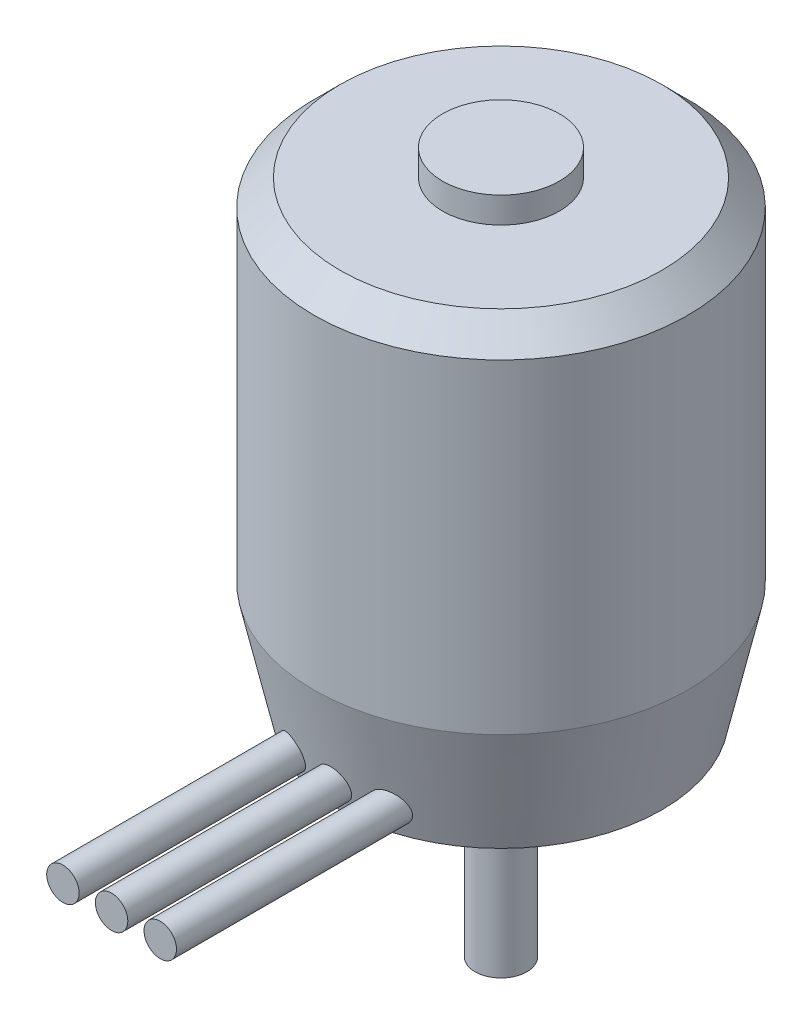
ISO-10303-21;
HEADER;
FILE_DESCRIPTION(('STEP AP214'),'2;1');
FILE_NAME('part.step','',(''),(''),'','','');
FILE_SCHEMA(('AUTOMOTIVE_DESIGN { 1 0 10303 214 1 1 1 1 }'));
ENDSEC;
DATA;
#1=APPLICATION_CONTEXT('core data for automotive mechanical design processes');
#2=APPLICATION_PROTOCOL_DEFINITION('international standard','automotive_design',2000,#1);
#3=PRODUCT_CONTEXT('',#1,'mechanical');
#4=PRODUCT('Part','Part','',(#3));
#5=PRODUCT_RELATED_PRODUCT_CATEGORY('part','',(#4));
#6=PRODUCT_DEFINITION_FORMATION('','',#4);
#7=PRODUCT_DEFINITION_CONTEXT('part definition',#1,'design');
#8=PRODUCT_DEFINITION('design','',#6,#7);
#9=PRODUCT_DEFINITION_SHAPE('','',#8);
#10=(LENGTH_UNIT() NAMED_UNIT(*) SI_UNIT(.MILLI.,.METRE.));
#11=(NAMED_UNIT(*) PLANE_ANGLE_UNIT() SI_UNIT($,.RADIAN.));
#12=(NAMED_UNIT(*) SI_UNIT($,.STERADIAN.) SOLID_ANGLE_UNIT());
#13=UNCERTAINTY_MEASURE_WITH_UNIT(LENGTH_MEASURE(1.E-05),#10,'distance_accuracy_value','');
#14=(GEOMETRIC_REPRESENTATION_CONTEXT(3) GLOBAL_UNCERTAINTY_ASSIGNED_CONTEXT((#13)) GLOBAL_UNIT_ASSIGNED_CONTEXT((#10,
#11,#12)) REPRESENTATION_CONTEXT('',''));
#15=CARTESIAN_POINT('',(0.,0.,0.));
#16=DIRECTION('',(0.,0.,1.));
#17=DIRECTION('',(1.,0.,0.));
#18=AXIS2_PLACEMENT_3D('',#15,#16,#17);
#19=CARTESIAN_POINT('',(0.,-54.0247048165027,0.));
#20=DIRECTION('',(0.,1.,0.));
#21=DIRECTION('',(0.,0.,1.));
#22=AXIS2_PLACEMENT_3D('',#19,#20,#21);
#23=CONICAL_SURFACE('',#22,12.4,0.218668945873942);
#24=CARTESIAN_POINT('',(0.,-45.0247048165027,0.));
#25=DIRECTION('',(0.,1.,0.));
#26=DIRECTION('',(0.,0.,1.));
#27=AXIS2_PLACEMENT_3D('',#24,#25,#26);
#28=CIRCLE('',#27,14.4);
#29=CARTESIAN_POINT('',(0.,-45.0247048165027,14.4));
#30=VERTEX_POINT('',#29);
#31=EDGE_CURVE('E152',#30,#30,#28,.T.);
#32=ORIENTED_EDGE('',*,*,#31,.F.);
#33=EDGE_LOOP('',(#32));
#34=FACE_BOUND('',#33,.T.);
#35=CARTESIAN_POINT('',(0.,-54.0247048165027,0.));
#36=DIRECTION('',(0.,1.,0.));
#37=DIRECTION('',(0.,0.,1.));
#38=AXIS2_PLACEMENT_3D('',#35,#36,#37);
#39=CIRCLE('',#38,12.4);
#40=CARTESIAN_POINT('',(0.,-54.0247048165027,12.4));
#41=VERTEX_POINT('',#40);
#42=EDGE_CURVE('E156',#41,#41,#39,.T.);
#43=ORIENTED_EDGE('',*,*,#42,.T.);
#44=EDGE_LOOP('',(#43));
#45=FACE_BOUND('',#44,.T.);
#46=CARTESIAN_POINT('',(-0.894856304961052,-52.8974775208602,12.6188056007496));
#47=CARTESIAN_POINT('',(-0.846345103135006,-52.9472120296067,12.6111656166559));
#48=CARTESIAN_POINT('',(-0.793576864978535,-52.9929953524686,12.604435219772));
#49=CARTESIAN_POINT('',(-0.680987356765525,-53.0752407638937,12.5927159025926));
#50=CARTESIAN_POINT('',(-0.621159046153157,-53.1116934308457,12.5877287406824));
#51=CARTESIAN_POINT('',(-0.496178174970965,-53.1741324280857,12.5793879256304));
#52=CARTESIAN_POINT('',(-0.431027022786042,-53.2001215162407,12.5760338420121));
#53=CARTESIAN_POINT('',(-0.297257367755014,-53.2408570257483,12.5708514988487));
#54=CARTESIAN_POINT('',(-0.228639553895667,-53.2556056717991,12.5690229373667));
#55=CARTESIAN_POINT('',(-0.0900373401314496,-53.2734097892141,12.5668223936875));
#56=CARTESIAN_POINT('',(-0.0200563538741467,-53.2764914362166,12.566447150836));
#57=CARTESIAN_POINT('',(0.119434212905394,-53.2709422241226,12.5671288188694));
#58=CARTESIAN_POINT('',(0.188943783717849,-53.2623111245096,12.5681857591636));
#59=CARTESIAN_POINT('',(0.325476765356979,-53.2336003989975,12.5717734885063));
#60=CARTESIAN_POINT('',(0.392501534641407,-53.2135271299252,12.5743034592128));
#61=CARTESIAN_POINT('',(0.522205964891759,-53.1625346451718,12.5809265802104));
#62=CARTESIAN_POINT('',(0.584885662437372,-53.1316155208115,12.5850197173399));
#63=CARTESIAN_POINT('',(0.704181421930687,-53.0598272713308,12.5948869666487));
#64=CARTESIAN_POINT('',(0.760792683603932,-53.0189503517881,12.600662396332));
#65=CARTESIAN_POINT('',(0.866319070582212,-52.9284865042545,12.6139981315195));
#66=CARTESIAN_POINT('',(0.915234207977994,-52.8788995899474,12.6215584342196));
#67=CARTESIAN_POINT('',(1.00422666868814,-52.7722809447219,12.6385585274154));
#68=CARTESIAN_POINT('',(1.04426739599402,-52.7152198752405,12.6480058059333));
#69=CARTESIAN_POINT('',(1.11422402824881,-52.5955044574222,12.6687416696049));
#70=CARTESIAN_POINT('',(1.14413947828119,-52.5328498579343,12.6800303374562));
#71=CARTESIAN_POINT('',(1.1934277481378,-52.4030021668634,12.704469488889));
#72=CARTESIAN_POINT('',(1.21267311957141,-52.3357645504836,12.717640211047));
#73=CARTESIAN_POINT('',(1.2396951862456,-52.199329849664,12.7454968702711));
#74=CARTESIAN_POINT('',(1.24747063220397,-52.1301325526161,12.760182972203));
#75=CARTESIAN_POINT('',(1.25152315878021,-51.9902144566371,12.7910279332391));
#76=CARTESIAN_POINT('',(1.24755694001466,-51.919491994871,12.8072111279232));
#77=CARTESIAN_POINT('',(1.22781677737388,-51.7798819830909,12.8402847418432));
#78=CARTESIAN_POINT('',(1.21204115361697,-51.7109946955732,12.857175261373));
#79=CARTESIAN_POINT('',(1.16869620098501,-51.5754655257624,12.8914297002414));
#80=CARTESIAN_POINT('',(1.14088645624252,-51.5089010401906,12.9087961184972));
#81=CARTESIAN_POINT('',(1.07417398394799,-51.3814109927928,12.9429468025529));
#82=CARTESIAN_POINT('',(1.03527043909739,-51.3204858468646,12.9597310253593));
#83=CARTESIAN_POINT('',(0.947232187158211,-51.2058731085233,12.9920001306052));
#84=CARTESIAN_POINT('',(0.898071947626384,-51.1522041393643,13.0074816325387));
#85=CARTESIAN_POINT('',(0.790840453608683,-51.0539543166066,13.0363139972973));
#86=CARTESIAN_POINT('',(0.732770476036033,-51.0093721628451,13.0496651648762));
#87=CARTESIAN_POINT('',(0.611011643812474,-50.9318976131694,13.0731594496612));
#88=CARTESIAN_POINT('',(0.547521255406644,-50.8987174309356,13.0833807003312));
#89=CARTESIAN_POINT('',(0.415422825698364,-50.8435860711981,13.1004977011744));
#90=CARTESIAN_POINT('',(0.346816335143889,-50.8216315068084,13.1073944543471));
#91=CARTESIAN_POINT('',(0.209629322345072,-50.7904891093717,13.1172115958835));
#92=CARTESIAN_POINT('',(0.14117597162765,-50.7807902526124,13.1202910394374));
#93=CARTESIAN_POINT('',(0.00354539297814122,-50.7728117500985,13.122822727134));
#94=CARTESIAN_POINT('',(-0.0656316998802527,-50.7745300102017,13.1222756364603));
#95=CARTESIAN_POINT('',(-0.200831992790418,-50.7891201301702,13.1176513868978));
#96=CARTESIAN_POINT('',(-0.266890347030389,-50.8016987805839,13.1136670298289));
#97=CARTESIAN_POINT('',(-0.395890910053305,-50.8371671367217,13.1025215683412));
#98=CARTESIAN_POINT('',(-0.458833034160296,-50.8600571224609,13.0953603776522));
#99=CARTESIAN_POINT('',(-0.580603039479891,-50.9156829704859,13.0781568454965));
#100=CARTESIAN_POINT('',(-0.639379318179099,-50.9485222028727,13.0680843090315));
#101=CARTESIAN_POINT('',(-0.750616586187429,-51.0229289640814,13.045605506301));
#102=CARTESIAN_POINT('',(-0.803076455039936,-51.0644980378959,13.0331988269834));
#103=CARTESIAN_POINT('',(-0.902352674133521,-51.1569296579293,13.0061200928984));
#104=CARTESIAN_POINT('',(-0.948875112599773,-51.2080876798836,12.9913793630858));
#105=CARTESIAN_POINT('',(-1.03274234306664,-51.3171197813552,12.9606760303748));
#106=CARTESIAN_POINT('',(-1.07008518099734,-51.3749952869762,12.9447131682667));
#107=CARTESIAN_POINT('',(-1.13599044366148,-51.4983032672073,12.9115925790502));
#108=CARTESIAN_POINT('',(-1.16415731130671,-51.5639414713459,12.8944125174864));
#109=CARTESIAN_POINT('',(-1.20893696353795,-51.6990690499777,12.8601311069967));
#110=CARTESIAN_POINT('',(-1.22554887153459,-51.7685587162211,12.8430297641404));
#111=CARTESIAN_POINT('',(-1.24687606903758,-51.9105591674436,12.8092727562553));
#112=CARTESIAN_POINT('',(-1.25141282796949,-51.9830993516317,12.7926273427621));
#113=CARTESIAN_POINT('',(-1.24782183579188,-52.1281657184148,12.7605878423484));
#114=CARTESIAN_POINT('',(-1.23969193128432,-52.2006918965322,12.7451939686643));
#115=CARTESIAN_POINT('',(-1.21102066034535,-52.3426899031741,12.7162523674029));
#116=CARTESIAN_POINT('',(-1.19062867365398,-52.4121878639616,12.7026847881798));
#117=CARTESIAN_POINT('',(-1.13801099664842,-52.5468575819025,12.6774598220234));
#118=CARTESIAN_POINT('',(-1.10580026727052,-52.6120346860574,12.6658000469314));
#119=CARTESIAN_POINT('',(-1.04365208767075,-52.7142825597604,12.6482423061933));
#120=CARTESIAN_POINT('',(-1.01686768601092,-52.7532038603307,12.6417563710055));
#121=CARTESIAN_POINT('',(-0.958999943909115,-52.8278542666365,12.6296413531301));
#122=CARTESIAN_POINT('',(-0.927916698785803,-52.8635834431225,12.6240122514497));
#123=CARTESIAN_POINT('',(-0.894856304961052,-52.8974775208602,12.6188056007496));
#124=B_SPLINE_CURVE_WITH_KNOTS('',3,(#46,#47,#48,#49,#50,#51,#52,#53,#54,#55,#56,#57,#58,#59,
#60,#61,#62,#63,#64,#65,#66,#67,#68,#69,#70,#71,#72,#73,#74,#75,#76,#77,#78,#79,#80,#81,#82,#83,
#84,#85,#86,#87,#88,#89,#90,#91,#92,#93,#94,#95,#96,#97,#98,#99,#100,#101,#102,#103,#104,#105,
#106,#107,#108,#109,#110,#111,#112,#113,#114,#115,#116,#117,#118,#119,#120,#121,#122,#123),
.UNSPECIFIED.,.T.,.F.,(4,2,2,2,2,2,2,2,2,2,2,2,2,2,2,2,2,2,2,2,2,2,2,2,2,2,2,2,2,2,2,2,2,2,2,2,
2,2,4),(0.,0.209510938403255,0.419232602862131,0.628898955108635,0.838523799591173,
1.04767805802813,1.25683661142807,1.46587907752036,1.67491978354113,1.88412464404137,
2.09332917587384,2.3033809980887,2.51344225642713,2.72596131540384,2.93850351983898,
3.15548043469969,3.37248822027949,3.59404742052202,3.81562294761553,4.03775677807918,
4.2598588027666,4.47585222275413,4.6917804367653,4.89837114698654,5.10492396512177,
5.30606866966477,5.50721883682814,5.71053507054672,5.91388731719801,6.12504504030101,
6.33624767389165,6.55562072037157,6.77501040724854,6.99762619626549,7.22027983524312,
7.44027449774615,7.65999163202693,7.80277654426407,7.94555829102521),.UNSPECIFIED.);
#125=CARTESIAN_POINT('',(-0.894856304961052,-52.8974775208602,12.6188056007496));
#126=VERTEX_POINT('',#125);
#127=EDGE_CURVE('E57',#126,#126,#124,.T.);
#128=ORIENTED_EDGE('',*,*,#127,.F.);
#129=EDGE_LOOP('',(#128));
#130=FACE_BOUND('',#129,.T.);
#131=CARTESIAN_POINT('',(3.03347186471275,-53.0489545083952,12.2467356277016));
#132=CARTESIAN_POINT('',(3.09408833278642,-53.0913556184177,12.2220132051164));
#133=CARTESIAN_POINT('',(3.15846846131152,-53.1283592412067,12.1970772116894));
#134=CARTESIAN_POINT('',(3.29281547516374,-53.1904544202445,12.1472003159454));
#135=CARTESIAN_POINT('',(3.36278956201558,-53.2155303229101,12.1222594499164));
#136=CARTESIAN_POINT('',(3.50623829721733,-53.2529440381038,12.0728909146064));
#137=CARTESIAN_POINT('',(3.57971245981064,-53.2652836128809,12.0484631747857));
#138=CARTESIAN_POINT('',(3.72803513255933,-53.2767228611844,12.0007357371516));
#139=CARTESIAN_POINT('',(3.80288329467328,-53.2758258426243,11.9774357589633));
#140=CARTESIAN_POINT('',(3.95094492444576,-53.2606647973468,11.93295761516));
#141=CARTESIAN_POINT('',(4.02416731165254,-53.2465506179046,11.911758605094));
#142=CARTESIAN_POINT('',(4.16761488465627,-53.2052406238288,11.8720605386878));
#143=CARTESIAN_POINT('',(4.23784051133009,-53.1780467407266,11.8535610842192));
#144=CARTESIAN_POINT('',(4.36994547134785,-53.1125280900612,11.8210046488198));
#145=CARTESIAN_POINT('',(4.43205735402293,-53.0747538181402,11.8067863391101));
#146=CARTESIAN_POINT('',(4.54929936775414,-52.988503443404,11.7826572584409));
#147=CARTESIAN_POINT('',(4.60443325469385,-52.9400331365732,11.7727441631669));
#148=CARTESIAN_POINT('',(4.70209126106863,-52.8375245356106,11.7586040548198));
#149=CARTESIAN_POINT('',(4.74523083736378,-52.7841209719252,11.7540250019725));
#150=CARTESIAN_POINT('',(4.82223907579733,-52.6708377221359,11.7498584646615));
#151=CARTESIAN_POINT('',(4.85611187398373,-52.6109609419315,11.7502687495743));
#152=CARTESIAN_POINT('',(4.911854293247,-52.4902778281962,11.7561442780891));
#153=CARTESIAN_POINT('',(4.93430231548076,-52.4297231144716,11.7613173726377));
#154=CARTESIAN_POINT('',(4.96952899464601,-52.3064142903337,11.7762241392066));
#155=CARTESIAN_POINT('',(4.98230799677703,-52.2436602585233,11.7859576483928));
#156=CARTESIAN_POINT('',(4.99816210654692,-52.1176276961352,11.8096612005408));
#157=CARTESIAN_POINT('',(5.0012192323348,-52.054348410433,11.8236390417076));
#158=CARTESIAN_POINT('',(4.99790730788882,-51.9289814400443,11.8552787556471));
#159=CARTESIAN_POINT('',(4.99153586957039,-51.8668940612813,11.872941560781));
#160=CARTESIAN_POINT('',(4.9691778914411,-51.7410337551354,11.9126285013856));
#161=CARTESIAN_POINT('',(4.95255394932831,-51.6774435227195,11.9348704179116));
#162=CARTESIAN_POINT('',(4.91001429609427,-51.5544874930418,11.981967719589));
#163=CARTESIAN_POINT('',(4.88409469197089,-51.4951234782131,12.0068241966255));
#164=CARTESIAN_POINT('',(4.82074402350351,-51.375842495485,12.0609620981626));
#165=CARTESIAN_POINT('',(4.78240403248701,-51.3164950217296,12.0904357873502));
#166=CARTESIAN_POINT('',(4.69665051196157,-51.2053861781305,12.1504798300949));
#167=CARTESIAN_POINT('',(4.64923290052398,-51.1536282396297,12.1810506719639));
#168=CARTESIAN_POINT('',(4.54237481633082,-51.0549952525763,12.2447040076466));
#169=CARTESIAN_POINT('',(4.48227970440111,-51.0088311883726,12.2777937355609));
#170=CARTESIAN_POINT('',(4.35429562636025,-50.9278630389365,12.3428448323757));
#171=CARTESIAN_POINT('',(4.28640511751009,-50.8930612075893,12.374805976283));
#172=CARTESIAN_POINT('',(4.14410213574959,-50.8359699215707,12.4365596535657));
#173=CARTESIAN_POINT('',(4.06965620841018,-50.8137495286314,12.4663394507856));
#174=CARTESIAN_POINT('',(3.91663891712942,-50.7834127558529,12.5223193893351));
#175=CARTESIAN_POINT('',(3.83806944132278,-50.7752899779025,12.5485211495564));
#176=CARTESIAN_POINT('',(3.68495825325505,-50.7742195508789,12.5945452137768));
#177=CARTESIAN_POINT('',(3.61052066750269,-50.780247274762,12.6146861095288));
#178=CARTESIAN_POINT('',(3.46282789167272,-50.8058376613339,12.6501290059092));
#179=CARTESIAN_POINT('',(3.38957193408575,-50.825391143776,12.6654342783298));
#180=CARTESIAN_POINT('',(3.25351644640917,-50.8754552646343,12.6895460021465));
#181=CARTESIAN_POINT('',(3.19037176509052,-50.9048081383533,12.698816781111));
#182=CARTESIAN_POINT('',(3.06948093694394,-50.9738793376385,12.7127888512832));
#183=CARTESIAN_POINT('',(3.01173293191315,-51.0135940773768,12.7174917206082));
#184=CARTESIAN_POINT('',(2.90645424623577,-51.0998709600958,12.7222879452568));
#185=CARTESIAN_POINT('',(2.85854457506863,-51.1459594772136,12.722612080102));
#186=CARTESIAN_POINT('',(2.77068817870192,-51.2450684414393,12.7194943521472));
#187=CARTESIAN_POINT('',(2.73074110103448,-51.2980885815436,12.7160526560872));
#188=CARTESIAN_POINT('',(2.65985166760603,-51.4095307800909,12.7057692923275));
#189=CARTESIAN_POINT('',(2.62890951649515,-51.4679529612635,12.6989275473662));
#190=CARTESIAN_POINT('',(2.5767104128243,-51.5885719394052,12.6822714569141));
#191=CARTESIAN_POINT('',(2.55545478123613,-51.650769249887,12.6724567062917));
#192=CARTESIAN_POINT('',(2.52243654647236,-51.779451793121,12.6499131955799));
#193=CARTESIAN_POINT('',(2.51102259749864,-51.8460109212916,12.6370964341724));
#194=CARTESIAN_POINT('',(2.49901260352434,-51.979623600118,12.6092089684079));
#195=CARTESIAN_POINT('',(2.49841824827072,-52.046677226366,12.5941379123577));
#196=CARTESIAN_POINT('',(2.50805404047622,-52.1825327626742,12.5614382585202));
#197=CARTESIAN_POINT('',(2.51876516988406,-52.2512804177826,12.5437259058477));
#198=CARTESIAN_POINT('',(2.55125599720707,-52.3856688935102,12.5066800274635));
#199=CARTESIAN_POINT('',(2.57304037051849,-52.4513083889801,12.4873458198463));
#200=CARTESIAN_POINT('',(2.62799222405695,-52.5803214192317,12.4465995010083));
#201=CARTESIAN_POINT('',(2.6615803795838,-52.6434991317099,12.4251351970323));
#202=CARTESIAN_POINT('',(2.73877294958224,-52.7629233492432,12.3811690980256));
#203=CARTESIAN_POINT('',(2.78236740528126,-52.8191766608589,12.3586683521933));
#204=CARTESIAN_POINT('',(2.86086767007223,-52.9044710501536,12.3212107602295));
#205=CARTESIAN_POINT('',(2.89321871679685,-52.9359988152731,12.3064667405586));
#206=CARTESIAN_POINT('',(2.96107227933267,-52.9953358626241,12.2767534017467));
#207=CARTESIAN_POINT('',(2.99657483240318,-53.0231451008829,12.2617840799438));
#208=CARTESIAN_POINT('',(3.03347186471275,-53.0489545083952,12.2467356277016));
#209=B_SPLINE_CURVE_WITH_KNOTS('',3,(#131,#132,#133,#134,#135,#136,#137,#138,#139,#140,#141,
#142,#143,#144,#145,#146,#147,#148,#149,#150,#151,#152,#153,#154,#155,#156,#157,#158,#159,#160,
#161,#162,#163,#164,#165,#166,#167,#168,#169,#170,#171,#172,#173,#174,#175,#176,#177,#178,#179,
#180,#181,#182,#183,#184,#185,#186,#187,#188,#189,#190,#191,#192,#193,#194,#195,#196,#197,#198,
#199,#200,#201,#202,#203,#204,#205,#206,#207,#208),.UNSPECIFIED.,.T.,.F.,(4,2,2,2,2,2,2,2,2,2,2,
2,2,2,2,2,2,2,2,2,2,2,2,2,2,2,2,2,2,2,2,2,2,2,2,2,2,2,4),(0.,0.233816075070429,
0.467938162485218,0.702027851489738,0.936059040900011,1.16746865685007,1.39884411011844,
1.61990081193642,1.84083802006823,2.0461764012024,2.25142298342372,2.44486256007249,
2.63829523029222,2.83208547145101,3.02592480457057,3.23323438119832,3.4406308801859,
3.66932972444023,3.8981316501675,4.1450477009016,4.39201270176864,4.64032051196674,
4.88851559977578,5.1192986682092,5.3499252523064,5.55958482058391,5.76917193007233,
5.96766694805335,6.16615317760881,6.36464391770217,6.56316171831639,6.76845306982744,
6.97377648238151,7.18820119748213,7.40271652327343,7.62581704664505,7.8486964846185,
7.99101782966433,8.13334085755648),.UNSPECIFIED.);
#210=CARTESIAN_POINT('',(3.03347186471275,-53.0489545083952,12.2467356277016));
#211=VERTEX_POINT('',#210);
#212=EDGE_CURVE('E53',#211,#211,#209,.T.);
#213=ORIENTED_EDGE('',*,*,#212,.F.);
#214=EDGE_LOOP('',(#213));
#215=FACE_BOUND('',#214,.T.);
#216=CARTESIAN_POINT('',(-4.46564195929878,-53.0495738745248,11.7999599115841));
#217=CARTESIAN_POINT('',(-4.40723744864073,-53.0903519225299,11.8123730823187));
#218=CARTESIAN_POINT('',(-4.34556496839138,-53.1259642588694,11.8268042457465));
#219=CARTESIAN_POINT('',(-4.21769759178863,-53.1860705734683,11.8588311862295));
#220=CARTESIAN_POINT('',(-4.15149359706919,-53.2105413808967,11.8764334530903));
#221=CARTESIAN_POINT('',(-4.01676267998631,-53.2478999280954,11.9139131697781));
#222=CARTESIAN_POINT('',(-3.94824377382249,-53.2608240871186,11.9337832414955));
#223=CARTESIAN_POINT('',(-3.81053499333861,-53.2751561860704,11.975123390013));
#224=CARTESIAN_POINT('',(-3.74134536361318,-53.2765681768918,11.9965929013198));
#225=CARTESIAN_POINT('',(-3.60086160097132,-53.2678586901656,12.0415458027765));
#226=CARTESIAN_POINT('',(-3.52961509601429,-53.2572091189464,12.0650763791845));
#227=CARTESIAN_POINT('',(-3.39015557296129,-53.2239352702586,12.1126819231121));
#228=CARTESIAN_POINT('',(-3.32194333437576,-53.2013079347137,12.1367570281536));
#229=CARTESIAN_POINT('',(-3.18840986198111,-53.1438812631411,12.1857228560472));
#230=CARTESIAN_POINT('',(-3.12323908441483,-53.1087335300541,12.2106161675719));
#231=CARTESIAN_POINT('',(-3.0000174271302,-53.0274385156567,12.2600729092805));
#232=CARTESIAN_POINT('',(-2.94196688375953,-52.9812907150247,12.2846363238318));
#233=CARTESIAN_POINT('',(-2.83457067370074,-52.8791068473655,12.3331625672242));
#234=CARTESIAN_POINT('',(-2.78525827047569,-52.8230345531274,12.3571228152797));
#235=CARTESIAN_POINT('',(-2.69722184690432,-52.7027265025727,12.4039986444863));
#236=CARTESIAN_POINT('',(-2.6584974084593,-52.6384910687497,12.4269142668577));
#237=CARTESIAN_POINT('',(-2.59347018364386,-52.5046970686633,12.4710163334274));
#238=CARTESIAN_POINT('',(-2.56699832657601,-52.4352273538453,12.49222275804));
#239=CARTESIAN_POINT('',(-2.52670179495418,-52.2922094875423,12.5328587508264));
#240=CARTESIAN_POINT('',(-2.51287577399611,-52.2186617711271,12.552288507964));
#241=CARTESIAN_POINT('',(-2.49876885254458,-52.0717700585084,12.588385317436));
#242=CARTESIAN_POINT('',(-2.49812611229055,-51.998476021849,12.6051136245392));
#243=CARTESIAN_POINT('',(-2.50977356448479,-51.8523486660816,12.6359085683521));
#244=CARTESIAN_POINT('',(-2.52206106631574,-51.7795152542957,12.6499757580876));
#245=CARTESIAN_POINT('',(-2.55872984848876,-51.6394692397803,12.6743592991003));
#246=CARTESIAN_POINT('',(-2.58261245373809,-51.5721482731238,12.6848022233712));
#247=CARTESIAN_POINT('',(-2.64172750160149,-51.4421906551017,12.7021213350919));
#248=CARTESIAN_POINT('',(-2.67695640327409,-51.3795525498174,12.7089986335537));
#249=CARTESIAN_POINT('',(-2.75593776494384,-51.2637687923227,12.7184279018378));
#250=CARTESIAN_POINT('',(-2.79922163391637,-51.2103184092271,12.7211649000468));
#251=CARTESIAN_POINT('',(-2.8939978440698,-51.1112185007376,12.7225241431081));
#252=CARTESIAN_POINT('',(-2.94548796926692,-51.0655668762744,12.7211474970157));
#253=CARTESIAN_POINT('',(-3.05315567475449,-50.9848593752984,12.7141740385369));
#254=CARTESIAN_POINT('',(-3.10910960439788,-50.9494916979827,12.7087247992653));
#255=CARTESIAN_POINT('',(-3.22545181460484,-50.8881871842326,12.6937528363537));
#256=CARTESIAN_POINT('',(-3.28583987072494,-50.8622498708537,12.6842303187745));
#257=CARTESIAN_POINT('',(-3.40933497021269,-50.8202511292299,12.6612617613738));
#258=CARTESIAN_POINT('',(-3.47244595776233,-50.8042045793462,12.6478098552784));
#259=CARTESIAN_POINT('',(-3.599538152754,-50.7821170732105,12.6173325970357));
#260=CARTESIAN_POINT('',(-3.66351951622941,-50.7760779354814,12.6003065960456));
#261=CARTESIAN_POINT('',(-3.79387516784838,-50.7736928064669,12.5622434956035));
#262=CARTESIAN_POINT('',(-3.8602122897613,-50.777838395278,12.541050250596));
#263=CARTESIAN_POINT('',(-3.99048186031664,-50.7962907251055,12.4959056897089));
#264=CARTESIAN_POINT('',(-4.05441347421989,-50.8106009597472,12.4719534279173));
#265=CARTESIAN_POINT('',(-4.18372380105101,-50.850256289917,12.4199057906979));
#266=CARTESIAN_POINT('',(-4.24877875900365,-50.8764219345902,12.3916314848081));
#267=CARTESIAN_POINT('',(-4.37311698372871,-50.9388547689962,12.3335812060976));
#268=CARTESIAN_POINT('',(-4.43239785944875,-50.9751261197111,12.3038046188635));
#269=CARTESIAN_POINT('',(-4.54843523633018,-51.0600433599393,12.2412800122046));
#270=CARTESIAN_POINT('',(-4.60461484628788,-51.109444628032,12.2084841859823));
#271=CARTESIAN_POINT('',(-4.70745974969651,-51.2176451565536,12.1434147546276));
#272=CARTESIAN_POINT('',(-4.75412178349319,-51.2764476245209,12.1111413318844));
#273=CARTESIAN_POINT('',(-4.83754114782225,-51.4036740687666,12.047607715756));
#274=CARTESIAN_POINT('',(-4.87402891720863,-51.4722978597776,12.0163914819264));
#275=CARTESIAN_POINT('',(-4.93398974425157,-51.6163569333297,11.9572727310991));
#276=CARTESIAN_POINT('',(-4.95746688937549,-51.6917900679509,11.929369175545));
#277=CARTESIAN_POINT('',(-4.98890045805329,-51.8425366061558,11.8799302843026));
#278=CARTESIAN_POINT('',(-4.99771913037009,-51.917574581515,11.8581096516237));
#279=CARTESIAN_POINT('',(-5.00150011865069,-52.069359668303,11.8198995284357));
#280=CARTESIAN_POINT('',(-4.99647601604448,-52.1461050312808,11.8035047322091));
#281=CARTESIAN_POINT('',(-4.97343853221128,-52.2900755782735,11.7785081560105));
#282=CARTESIAN_POINT('',(-4.95690397026863,-52.357424958468,11.7692507373558));
#283=CARTESIAN_POINT('',(-4.91267180616853,-52.4889229675381,11.7561181029533));
#284=CARTESIAN_POINT('',(-4.88497651267058,-52.5530722552883,11.7522417748336));
#285=CARTESIAN_POINT('',(-4.82165325681148,-52.6714160130788,11.7499355403863));
#286=CARTESIAN_POINT('',(-4.78675259075266,-52.7259953637334,11.751128448275));
#287=CARTESIAN_POINT('',(-4.70912784479499,-52.8288913727341,11.7578215836237));
#288=CARTESIAN_POINT('',(-4.66641418905572,-52.8772162309027,11.7633161034989));
#289=CARTESIAN_POINT('',(-4.59632613856203,-52.9452308345377,11.7745913907164));
#290=CARTESIAN_POINT('',(-4.57129205625676,-52.9676263553824,11.7789988478416));
#291=CARTESIAN_POINT('',(-4.51962472488092,-53.0102499730871,11.7887767386562));
#292=CARTESIAN_POINT('',(-4.4929916531132,-53.0304783095637,11.7941470657091));
#293=CARTESIAN_POINT('',(-4.46564195929878,-53.0495738745248,11.7999599115841));
#294=B_SPLINE_CURVE_WITH_KNOTS('',3,(#216,#217,#218,#219,#220,#221,#222,#223,#224,#225,#226,
#227,#228,#229,#230,#231,#232,#233,#234,#235,#236,#237,#238,#239,#240,#241,#242,#243,#244,#245,
#246,#247,#248,#249,#250,#251,#252,#253,#254,#255,#256,#257,#258,#259,#260,#261,#262,#263,#264,
#265,#266,#267,#268,#269,#270,#271,#272,#273,#274,#275,#276,#277,#278,#279,#280,#281,#282,#283,
#284,#285,#286,#287,#288,#289,#290,#291,#292,#293),.UNSPECIFIED.,.T.,.F.,(4,2,2,2,2,2,2,2,2,2,2,
2,2,2,2,2,2,2,2,2,2,2,2,2,2,2,2,2,2,2,2,2,2,2,2,2,2,2,4),(0.,0.216782353205766,
0.434013508123126,0.650557050909864,0.867024393231551,1.09334838139324,1.31973018085154,
1.55297888177427,1.78623859672671,2.02036802891,2.25448821442918,2.48527372552356,
2.71603466198786,2.94045319458533,3.1648250378009,3.38030329628999,3.59571437358163,
3.80118061683325,4.00659147053819,4.20489952140142,4.40319754135834,4.60179313135314,
4.80042480570254,5.00883029207331,5.21730744284124,5.44316622297683,5.66911813730096,
5.91306220534574,6.15708968150128,6.40707354495709,6.65697882794204,6.89158372562481,
7.12595852962236,7.33473162803142,7.54346156271158,7.73694335088647,7.93016885234869,
8.03169503938365,8.13320998947473),.UNSPECIFIED.);
#295=CARTESIAN_POINT('',(-4.46564195929878,-53.0495738745248,11.7999599115841));
#296=VERTEX_POINT('',#295);
#297=EDGE_CURVE('E10',#296,#296,#294,.T.);
#298=ORIENTED_EDGE('',*,*,#297,.F.);
#299=EDGE_LOOP('',(#298));
#300=FACE_BOUND('',#299,.T.);
#301=ADVANCED_FACE('F41',(#34,#45,#130,#215,#300),#23,.T.);
#302=CARTESIAN_POINT('',(4.49999999999999,-18.0247048165027,0.));
#303=DIRECTION('',(0.,-1.,0.));
#304=DIRECTION('',(0.,0.,-1.));
#305=AXIS2_PLACEMENT_3D('',#302,#303,#304);
#306=PLANE('',#305);
#307=CARTESIAN_POINT('',(0.,-18.0247048165027,0.));
#308=DIRECTION('',(0.,1.,0.));
#309=DIRECTION('',(0.,0.,1.));
#310=AXIS2_PLACEMENT_3D('',#307,#308,#309);
#311=CIRCLE('',#310,4.49999999999999);
#312=CARTESIAN_POINT('',(0.,-18.0247048165027,4.49999999999999));
#313=VERTEX_POINT('',#312);
#314=EDGE_CURVE('E61',#313,#313,#311,.T.);
#315=ORIENTED_EDGE('',*,*,#314,.F.);
#316=EDGE_LOOP('',(#315));
#317=FACE_BOUND('',#316,.T.);
#318=CARTESIAN_POINT('',(0.,-18.0247048165027,0.));
#319=DIRECTION('',(0.,1.,0.));
#320=DIRECTION('',(0.,0.,1.));
#321=AXIS2_PLACEMENT_3D('',#318,#319,#320);
#322=CIRCLE('',#321,12.4);
#323=CARTESIAN_POINT('',(0.,-18.0247048165027,12.4));
#324=VERTEX_POINT('',#323);
#325=EDGE_CURVE('E196',#324,#324,#322,.T.);
#326=ORIENTED_EDGE('',*,*,#325,.T.);
#327=EDGE_LOOP('',(#326));
#328=FACE_BOUND('',#327,.T.);
#329=ADVANCED_FACE('F43',(#317,#328),#306,.F.);
#330=CARTESIAN_POINT('',(0.,0.,0.));
#331=DIRECTION('',(0.,1.,0.));
#332=DIRECTION('',(0.,0.,1.));
#333=AXIS2_PLACEMENT_3D('',#330,#331,#332);
#334=CYLINDRICAL_SURFACE('',#333,4.49999999999999);
#335=CARTESIAN_POINT('',(0.,-16.0247048165027,0.));
#336=DIRECTION('',(0.,1.,0.));
#337=DIRECTION('',(0.,0.,1.));
#338=AXIS2_PLACEMENT_3D('',#335,#336,#337);
#339=CIRCLE('',#338,4.49999999999999);
#340=CARTESIAN_POINT('',(0.,-16.0247048165027,4.49999999999999));
#341=VERTEX_POINT('',#340);
#342=EDGE_CURVE('E188',#341,#341,#339,.T.);
#343=ORIENTED_EDGE('',*,*,#342,.F.);
#344=EDGE_LOOP('',(#343));
#345=FACE_BOUND('',#344,.T.);
#346=ORIENTED_EDGE('',*,*,#314,.T.);
#347=EDGE_LOOP('',(#346));
#348=FACE_BOUND('',#347,.T.);
#349=ADVANCED_FACE('F147',(#345,#348),#334,.T.);
#350=CARTESIAN_POINT('',(0.,-16.0247048165027,0.));
#351=DIRECTION('',(0.,-1.,0.));
#352=DIRECTION('',(0.,0.,-1.));
#353=AXIS2_PLACEMENT_3D('',#350,#351,#352);
#354=PLANE('',#353);
#355=ORIENTED_EDGE('',*,*,#342,.T.);
#356=EDGE_LOOP('',(#355));
#357=FACE_BOUND('',#356,.T.);
#358=ADVANCED_FACE('F407',(#357),#354,.F.);
#359=CARTESIAN_POINT('',(0.,-70.0247048165027,0.));
#360=DIRECTION('',(0.,1.,0.));
#361=DIRECTION('',(0.,0.,1.));
#362=AXIS2_PLACEMENT_3D('',#359,#360,#361);
#363=PLANE('',#362);
#364=CARTESIAN_POINT('',(0.,-70.0247048165027,0.));
#365=DIRECTION('',(0.,1.,0.));
#366=DIRECTION('',(0.,0.,1.));
#367=AXIS2_PLACEMENT_3D('',#364,#365,#366);
#368=CIRCLE('',#367,2.);
#369=CARTESIAN_POINT('',(0.,-70.0247048165027,2.));
#370=VERTEX_POINT('',#369);
#371=EDGE_CURVE('E185',#370,#370,#368,.T.);
#372=ORIENTED_EDGE('',*,*,#371,.F.);
#373=EDGE_LOOP('',(#372));
#374=FACE_BOUND('',#373,.T.);
#375=ADVANCED_FACE('F397',(#374),#363,.F.);
#376=CARTESIAN_POINT('',(0.,0.,0.));
#377=DIRECTION('',(0.,1.,0.));
#378=DIRECTION('',(0.,0.,1.));
#379=AXIS2_PLACEMENT_3D('',#376,#377,#378);
#380=CYLINDRICAL_SURFACE('',#379,2.);
#381=CARTESIAN_POINT('',(0.,-58.3688363298948,0.));
#382=DIRECTION('',(0.,1.,0.));
#383=DIRECTION('',(0.,0.,1.));
#384=AXIS2_PLACEMENT_3D('',#381,#382,#383);
#385=CIRCLE('',#384,2.);
#386=CARTESIAN_POINT('',(0.,-58.3688363298948,2.));
#387=VERTEX_POINT('',#386);
#388=EDGE_CURVE('E182',#387,#387,#385,.T.);
#389=ORIENTED_EDGE('',*,*,#388,.F.);
#390=EDGE_LOOP('',(#389));
#391=FACE_BOUND('',#390,.T.);
#392=ORIENTED_EDGE('',*,*,#371,.T.);
#393=EDGE_LOOP('',(#392));
#394=FACE_BOUND('',#393,.T.);
#395=ADVANCED_FACE('F387',(#391,#394),#380,.T.);
#396=CARTESIAN_POINT('',(2.,-58.3688363298948,0.));
#397=DIRECTION('',(0.,1.,0.));
#398=DIRECTION('',(0.,0.,1.));
#399=AXIS2_PLACEMENT_3D('',#396,#397,#398);
#400=PLANE('',#399);
#401=CARTESIAN_POINT('',(0.,-58.3688363298948,0.));
#402=DIRECTION('',(0.,1.,0.));
#403=DIRECTION('',(0.,0.,1.));
#404=AXIS2_PLACEMENT_3D('',#401,#402,#403);
#405=CIRCLE('',#404,3.90000000000001);
#406=CARTESIAN_POINT('',(0.,-58.3688363298948,3.90000000000001));
#407=VERTEX_POINT('',#406);
#408=EDGE_CURVE('E179',#407,#407,#405,.T.);
#409=ORIENTED_EDGE('',*,*,#408,.F.);
#410=EDGE_LOOP('',(#409));
#411=FACE_BOUND('',#410,.T.);
#412=ORIENTED_EDGE('',*,*,#388,.T.);
#413=EDGE_LOOP('',(#412));
#414=FACE_BOUND('',#413,.T.);
#415=ADVANCED_FACE('F377',(#411,#414),#400,.F.);
#416=CARTESIAN_POINT('',(0.,0.,0.));
#417=DIRECTION('',(0.,1.,0.));
#418=DIRECTION('',(0.,0.,1.));
#419=AXIS2_PLACEMENT_3D('',#416,#417,#418);
#420=CYLINDRICAL_SURFACE('',#419,3.90000000000001);
#421=CARTESIAN_POINT('',(0.,-55.8247048165027,0.));
#422=DIRECTION('',(0.,1.,0.));
#423=DIRECTION('',(0.,0.,1.));
#424=AXIS2_PLACEMENT_3D('',#421,#422,#423);
#425=CIRCLE('',#424,3.90000000000001);
#426=CARTESIAN_POINT('',(0.,-55.8247048165027,3.90000000000001));
#427=VERTEX_POINT('',#426);
#428=EDGE_CURVE('E176',#427,#427,#425,.T.);
#429=ORIENTED_EDGE('',*,*,#428,.F.);
#430=EDGE_LOOP('',(#429));
#431=FACE_BOUND('',#430,.T.);
#432=ORIENTED_EDGE('',*,*,#408,.T.);
#433=EDGE_LOOP('',(#432));
#434=FACE_BOUND('',#433,.T.);
#435=ADVANCED_FACE('F367',(#431,#434),#420,.T.);
#436=CARTESIAN_POINT('',(0.,-55.8247048165027,0.));
#437=DIRECTION('',(0.,-1.,0.));
#438=DIRECTION('',(0.,0.,-1.));
#439=AXIS2_PLACEMENT_3D('',#436,#437,#438);
#440=CONICAL_SURFACE('',#439,3.90000000000001,0.78539816339746);
#441=CARTESIAN_POINT('',(0.,-54.8247048165027,0.));
#442=DIRECTION('',(0.,1.,0.));
#443=DIRECTION('',(0.,0.,1.));
#444=AXIS2_PLACEMENT_3D('',#441,#442,#443);
#445=CIRCLE('',#444,2.89999999999999);
#446=CARTESIAN_POINT('',(0.,-54.8247048165027,2.89999999999999));
#447=VERTEX_POINT('',#446);
#448=EDGE_CURVE('E173',#447,#447,#445,.T.);
#449=ORIENTED_EDGE('',*,*,#448,.F.);
#450=EDGE_LOOP('',(#449));
#451=FACE_BOUND('',#450,.T.);
#452=ORIENTED_EDGE('',*,*,#428,.T.);
#453=EDGE_LOOP('',(#452));
#454=FACE_BOUND('',#453,.T.);
#455=ADVANCED_FACE('F357',(#451,#454),#440,.T.);
#456=CARTESIAN_POINT('',(2.00000000000001,-54.8247048165027,0.));
#457=DIRECTION('',(0.,-1.,0.));
#458=DIRECTION('',(0.,0.,-1.));
#459=AXIS2_PLACEMENT_3D('',#456,#457,#458);
#460=PLANE('',#459);
#461=CARTESIAN_POINT('',(0.,-54.8247048165027,0.));
#462=DIRECTION('',(0.,1.,0.));
#463=DIRECTION('',(0.,0.,1.));
#464=AXIS2_PLACEMENT_3D('',#461,#462,#463);
#465=CIRCLE('',#464,2.00000000000001);
#466=CARTESIAN_POINT('',(0.,-54.8247048165027,2.00000000000001));
#467=VERTEX_POINT('',#466);
#468=EDGE_CURVE('E165',#467,#467,#465,.T.);
#469=ORIENTED_EDGE('',*,*,#468,.F.);
#470=EDGE_LOOP('',(#469));
#471=FACE_BOUND('',#470,.T.);
#472=ORIENTED_EDGE('',*,*,#448,.T.);
#473=EDGE_LOOP('',(#472));
#474=FACE_BOUND('',#473,.T.);
#475=ADVANCED_FACE('F347',(#471,#474),#460,.F.);
#476=CARTESIAN_POINT('',(0.,0.,0.));
#477=DIRECTION('',(0.,1.,0.));
#478=DIRECTION('',(0.,0.,1.));
#479=AXIS2_PLACEMENT_3D('',#476,#477,#478);
#480=CYLINDRICAL_SURFACE('',#479,2.);
#481=CARTESIAN_POINT('',(0.,-54.0247048165027,0.));
#482=DIRECTION('',(0.,1.,0.));
#483=DIRECTION('',(0.,0.,1.));
#484=AXIS2_PLACEMENT_3D('',#481,#482,#483);
#485=CIRCLE('',#484,2.);
#486=CARTESIAN_POINT('',(0.,-54.0247048165027,2.));
#487=VERTEX_POINT('',#486);
#488=EDGE_CURVE('E162',#487,#487,#485,.T.);
#489=ORIENTED_EDGE('',*,*,#488,.F.);
#490=EDGE_LOOP('',(#489));
#491=FACE_BOUND('',#490,.T.);
#492=ORIENTED_EDGE('',*,*,#468,.T.);
#493=EDGE_LOOP('',(#492));
#494=FACE_BOUND('',#493,.T.);
#495=ADVANCED_FACE('F138',(#491,#494),#480,.T.);
#496=CARTESIAN_POINT('',(2.,-54.0247048165027,0.));
#497=DIRECTION('',(0.,1.,0.));
#498=DIRECTION('',(0.,0.,1.));
#499=AXIS2_PLACEMENT_3D('',#496,#497,#498);
#500=PLANE('',#499);
#501=CARTESIAN_POINT('',(-5.65685424949231,-54.0247048165027,5.65685424949245));
#502=DIRECTION('',(0.,-1.,0.));
#503=DIRECTION('',(0.,0.,-1.));
#504=AXIS2_PLACEMENT_3D('',#501,#502,#503);
#505=CIRCLE('',#504,1.5);
#506=CARTESIAN_POINT('',(-5.65685424949231,-54.0247048165027,4.15685424949245));
#507=VERTEX_POINT('',#506);
#508=EDGE_CURVE('E210',#507,#507,#505,.T.);
#509=ORIENTED_EDGE('',*,*,#508,.F.);
#510=EDGE_LOOP('',(#509));
#511=FACE_BOUND('',#510,.T.);
#512=CARTESIAN_POINT('',(-6.71751442127226,-54.0247048165027,-6.71751442127214));
#513=DIRECTION('',(0.,-1.,0.));
#514=DIRECTION('',(0.,0.,-1.));
#515=AXIS2_PLACEMENT_3D('',#512,#513,#514);
#516=CIRCLE('',#515,1.5);
#517=CARTESIAN_POINT('',(-6.71751442127226,-54.0247048165027,-8.21751442127214));
#518=VERTEX_POINT('',#517);
#519=EDGE_CURVE('E217',#518,#518,#516,.T.);
#520=ORIENTED_EDGE('',*,*,#519,.F.);
#521=EDGE_LOOP('',(#520));
#522=FACE_BOUND('',#521,.T.);
#523=CARTESIAN_POINT('',(5.65685424949235,-54.0247048165027,-5.65685424949241));
#524=DIRECTION('',(0.,-1.,0.));
#525=DIRECTION('',(0.,0.,-1.));
#526=AXIS2_PLACEMENT_3D('',#523,#524,#525);
#527=CIRCLE('',#526,1.5);
#528=CARTESIAN_POINT('',(5.65685424949235,-54.0247048165027,-7.15685424949241));
#529=VERTEX_POINT('',#528);
#530=EDGE_CURVE('E205',#529,#529,#527,.T.);
#531=ORIENTED_EDGE('',*,*,#530,.F.);
#532=EDGE_LOOP('',(#531));
#533=FACE_BOUND('',#532,.T.);
#534=CARTESIAN_POINT('',(6.71751442127221,-54.0247048165027,6.71751442127219));
#535=DIRECTION('',(0.,-1.,0.));
#536=DIRECTION('',(0.,0.,-1.));
#537=AXIS2_PLACEMENT_3D('',#534,#535,#536);
#538=CIRCLE('',#537,1.5);
#539=CARTESIAN_POINT('',(6.71751442127221,-54.0247048165027,5.21751442127219));
#540=VERTEX_POINT('',#539);
#541=EDGE_CURVE('E201',#540,#540,#538,.T.);
#542=ORIENTED_EDGE('',*,*,#541,.F.);
#543=EDGE_LOOP('',(#542));
#544=FACE_BOUND('',#543,.T.);
#545=ORIENTED_EDGE('',*,*,#42,.F.);
#546=EDGE_LOOP('',(#545));
#547=FACE_BOUND('',#546,.T.);
#548=ORIENTED_EDGE('',*,*,#488,.T.);
#549=EDGE_LOOP('',(#548));
#550=FACE_BOUND('',#549,.T.);
#551=ADVANCED_FACE('F132',(#511,#522,#533,#544,#547,#550),#500,.F.);
#552=CARTESIAN_POINT('',(0.,0.,0.));
#553=DIRECTION('',(0.,1.,0.));
#554=DIRECTION('',(0.,0.,1.));
#555=AXIS2_PLACEMENT_3D('',#552,#553,#554);
#556=CYLINDRICAL_SURFACE('',#555,14.4);
#557=CARTESIAN_POINT('',(0.,-20.0247048165027,0.));
#558=DIRECTION('',(0.,1.,0.));
#559=DIRECTION('',(0.,0.,1.));
#560=AXIS2_PLACEMENT_3D('',#557,#558,#559);
#561=CIRCLE('',#560,14.4);
#562=CARTESIAN_POINT('',(0.,-20.0247048165027,14.4));
#563=VERTEX_POINT('',#562);
#564=EDGE_CURVE('E167',#563,#563,#561,.T.);
#565=ORIENTED_EDGE('',*,*,#564,.F.);
#566=EDGE_LOOP('',(#565));
#567=FACE_BOUND('',#566,.T.);
#568=ORIENTED_EDGE('',*,*,#31,.T.);
#569=EDGE_LOOP('',(#568));
#570=FACE_BOUND('',#569,.T.);
#571=ADVANCED_FACE('F129',(#567,#570),#556,.T.);
#572=CARTESIAN_POINT('',(0.,-20.0247048165027,0.));
#573=DIRECTION('',(0.,-1.,0.));
#574=DIRECTION('',(0.,0.,-1.));
#575=AXIS2_PLACEMENT_3D('',#572,#573,#574);
#576=CONICAL_SURFACE('',#575,14.4,0.785398163397448);
#577=ORIENTED_EDGE('',*,*,#325,.F.);
#578=EDGE_LOOP('',(#577));
#579=FACE_BOUND('',#578,.T.);
#580=ORIENTED_EDGE('',*,*,#564,.T.);
#581=EDGE_LOOP('',(#580));
#582=FACE_BOUND('',#581,.T.);
#583=ADVANCED_FACE('F126',(#579,#582),#576,.T.);
#584=CARTESIAN_POINT('',(6.71751442127221,-48.0247048165027,6.71751442127219));
#585=DIRECTION('',(0.,-1.,0.));
#586=DIRECTION('',(0.,0.,-1.));
#587=AXIS2_PLACEMENT_3D('',#584,#585,#586);
#588=CYLINDRICAL_SURFACE('',#587,1.5);
#589=CARTESIAN_POINT('',(6.71751442127221,-48.0247048165027,6.71751442127219));
#590=DIRECTION('',(0.,-1.,0.));
#591=DIRECTION('',(0.,0.,-1.));
#592=AXIS2_PLACEMENT_3D('',#589,#590,#591);
#593=CIRCLE('',#592,1.5);
#594=CARTESIAN_POINT('',(6.71751442127221,-48.0247048165027,5.21751442127219));
#595=VERTEX_POINT('',#594);
#596=EDGE_CURVE('E197',#595,#595,#593,.T.);
#597=ORIENTED_EDGE('',*,*,#596,.F.);
#598=EDGE_LOOP('',(#597));
#599=FACE_BOUND('',#598,.T.);
#600=ORIENTED_EDGE('',*,*,#541,.T.);
#601=EDGE_LOOP('',(#600));
#602=FACE_BOUND('',#601,.T.);
#603=ADVANCED_FACE('F122',(#599,#602),#588,.F.);
#604=CARTESIAN_POINT('',(6.71751442127221,-48.0247048165027,6.71751442127219));
#605=DIRECTION('',(0.,-1.,0.));
#606=DIRECTION('',(0.,0.,-1.));
#607=AXIS2_PLACEMENT_3D('',#604,#605,#606);
#608=PLANE('',#607);
#609=ORIENTED_EDGE('',*,*,#596,.T.);
#610=EDGE_LOOP('',(#609));
#611=FACE_BOUND('',#610,.T.);
#612=ADVANCED_FACE('F100',(#611),#608,.T.);
#613=CARTESIAN_POINT('',(5.65685424949235,-48.0247048165027,-5.65685424949241));
#614=DIRECTION('',(0.,-1.,0.));
#615=DIRECTION('',(0.,0.,-1.));
#616=AXIS2_PLACEMENT_3D('',#613,#614,#615);
#617=CYLINDRICAL_SURFACE('',#616,1.5);
#618=CARTESIAN_POINT('',(5.65685424949235,-48.0247048165027,-5.65685424949241));
#619=DIRECTION('',(0.,-1.,0.));
#620=DIRECTION('',(0.,0.,-1.));
#621=AXIS2_PLACEMENT_3D('',#618,#619,#620);
#622=CIRCLE('',#621,1.5);
#623=CARTESIAN_POINT('',(5.65685424949235,-48.0247048165027,-7.15685424949241));
#624=VERTEX_POINT('',#623);
#625=EDGE_CURVE('E220',#624,#624,#622,.T.);
#626=ORIENTED_EDGE('',*,*,#625,.F.);
#627=EDGE_LOOP('',(#626));
#628=FACE_BOUND('',#627,.T.);
#629=ORIENTED_EDGE('',*,*,#530,.T.);
#630=EDGE_LOOP('',(#629));
#631=FACE_BOUND('',#630,.T.);
#632=ADVANCED_FACE('F96',(#628,#631),#617,.F.);
#633=CARTESIAN_POINT('',(5.65685424949235,-48.0247048165027,-5.65685424949241));
#634=DIRECTION('',(0.,-1.,0.));
#635=DIRECTION('',(0.,0.,-1.));
#636=AXIS2_PLACEMENT_3D('',#633,#634,#635);
#637=PLANE('',#636);
#638=ORIENTED_EDGE('',*,*,#625,.T.);
#639=EDGE_LOOP('',(#638));
#640=FACE_BOUND('',#639,.T.);
#641=ADVANCED_FACE('F99',(#640),#637,.T.);
#642=CARTESIAN_POINT('',(-6.71751442127226,-48.0247048165027,-6.71751442127214));
#643=DIRECTION('',(0.,-1.,0.));
#644=DIRECTION('',(0.,0.,-1.));
#645=AXIS2_PLACEMENT_3D('',#642,#643,#644);
#646=CYLINDRICAL_SURFACE('',#645,1.5);
#647=CARTESIAN_POINT('',(-6.71751442127226,-48.0247048165027,-6.71751442127214));
#648=DIRECTION('',(0.,-1.,0.));
#649=DIRECTION('',(0.,0.,-1.));
#650=AXIS2_PLACEMENT_3D('',#647,#648,#649);
#651=CIRCLE('',#650,1.5);
#652=CARTESIAN_POINT('',(-6.71751442127226,-48.0247048165027,-8.21751442127214));
#653=VERTEX_POINT('',#652);
#654=EDGE_CURVE('E214',#653,#653,#651,.T.);
#655=ORIENTED_EDGE('',*,*,#654,.F.);
#656=EDGE_LOOP('',(#655));
#657=FACE_BOUND('',#656,.T.);
#658=ORIENTED_EDGE('',*,*,#519,.T.);
#659=EDGE_LOOP('',(#658));
#660=FACE_BOUND('',#659,.T.);
#661=ADVANCED_FACE('F104',(#657,#660),#646,.F.);
#662=CARTESIAN_POINT('',(-6.71751442127226,-48.0247048165027,-6.71751442127214));
#663=DIRECTION('',(0.,-1.,0.));
#664=DIRECTION('',(0.,0.,-1.));
#665=AXIS2_PLACEMENT_3D('',#662,#663,#664);
#666=PLANE('',#665);
#667=ORIENTED_EDGE('',*,*,#654,.T.);
#668=EDGE_LOOP('',(#667));
#669=FACE_BOUND('',#668,.T.);
#670=ADVANCED_FACE('F108',(#669),#666,.T.);
#671=CARTESIAN_POINT('',(-5.65685424949231,-48.0247048165027,5.65685424949245));
#672=DIRECTION('',(0.,-1.,0.));
#673=DIRECTION('',(0.,0.,-1.));
#674=AXIS2_PLACEMENT_3D('',#671,#672,#673);
#675=CYLINDRICAL_SURFACE('',#674,1.5);
#676=CARTESIAN_POINT('',(-5.65685424949231,-48.0247048165027,5.65685424949245));
#677=DIRECTION('',(0.,-1.,0.));
#678=DIRECTION('',(0.,0.,-1.));
#679=AXIS2_PLACEMENT_3D('',#676,#677,#678);
#680=CIRCLE('',#679,1.5);
#681=CARTESIAN_POINT('',(-5.65685424949231,-48.0247048165027,4.15685424949245));
#682=VERTEX_POINT('',#681);
#683=EDGE_CURVE('E207',#682,#682,#680,.T.);
#684=ORIENTED_EDGE('',*,*,#683,.F.);
#685=EDGE_LOOP('',(#684));
#686=FACE_BOUND('',#685,.T.);
#687=ORIENTED_EDGE('',*,*,#508,.T.);
#688=EDGE_LOOP('',(#687));
#689=FACE_BOUND('',#688,.T.);
#690=ADVANCED_FACE('F112',(#686,#689),#675,.F.);
#691=CARTESIAN_POINT('',(-5.65685424949231,-48.0247048165027,5.65685424949245));
#692=DIRECTION('',(0.,-1.,0.));
#693=DIRECTION('',(0.,0.,-1.));
#694=AXIS2_PLACEMENT_3D('',#691,#692,#693);
#695=PLANE('',#694);
#696=ORIENTED_EDGE('',*,*,#683,.T.);
#697=EDGE_LOOP('',(#696));
#698=FACE_BOUND('',#697,.T.);
#699=ADVANCED_FACE('F94',(#698),#695,.T.);
#700=CARTESIAN_POINT('',(0.,-52.0247048165027,30.));
#701=DIRECTION('',(0.,0.,-1.));
#702=DIRECTION('',(-1.,0.,0.));
#703=AXIS2_PLACEMENT_3D('',#700,#701,#702);
#704=CYLINDRICAL_SURFACE('',#703,1.25);
#705=CARTESIAN_POINT('',(0.,-52.0247048165027,30.));
#706=DIRECTION('',(0.,0.,1.));
#707=DIRECTION('',(1.,0.,0.));
#708=AXIS2_PLACEMENT_3D('',#705,#706,#707);
#709=CIRCLE('',#708,1.25);
#710=CARTESIAN_POINT('',(1.25000000000001,-52.0247048165027,30.));
#711=VERTEX_POINT('',#710);
#712=EDGE_CURVE('E211',#711,#711,#709,.T.);
#713=ORIENTED_EDGE('',*,*,#712,.F.);
#714=EDGE_LOOP('',(#713));
#715=FACE_BOUND('',#714,.T.);
#716=ORIENTED_EDGE('',*,*,#127,.T.);
#717=EDGE_LOOP('',(#716));
#718=FACE_BOUND('',#717,.T.);
#719=ADVANCED_FACE('F89',(#715,#718),#704,.T.);
#720=CARTESIAN_POINT('',(0.,-52.0247048165027,30.));
#721=DIRECTION('',(0.,0.,1.));
#722=DIRECTION('',(1.,0.,0.));
#723=AXIS2_PLACEMENT_3D('',#720,#721,#722);
#724=PLANE('',#723);
#725=ORIENTED_EDGE('',*,*,#712,.T.);
#726=EDGE_LOOP('',(#725));
#727=FACE_BOUND('',#726,.T.);
#728=ADVANCED_FACE('F81',(#727),#724,.T.);
#729=CARTESIAN_POINT('',(3.75,-52.0247048165027,30.));
#730=DIRECTION('',(0.,0.,-1.));
#731=DIRECTION('',(-1.,0.,0.));
#732=AXIS2_PLACEMENT_3D('',#729,#730,#731);
#733=CYLINDRICAL_SURFACE('',#732,1.25);
#734=CARTESIAN_POINT('',(3.75,-52.0247048165027,30.));
#735=DIRECTION('',(0.,0.,1.));
#736=DIRECTION('',(1.,0.,0.));
#737=AXIS2_PLACEMENT_3D('',#734,#735,#736);
#738=CIRCLE('',#737,1.25);
#739=CARTESIAN_POINT('',(5.00000000000001,-52.0247048165027,30.));
#740=VERTEX_POINT('',#739);
#741=EDGE_CURVE('E227',#740,#740,#738,.T.);
#742=ORIENTED_EDGE('',*,*,#741,.F.);
#743=EDGE_LOOP('',(#742));
#744=FACE_BOUND('',#743,.T.);
#745=ORIENTED_EDGE('',*,*,#212,.T.);
#746=EDGE_LOOP('',(#745));
#747=FACE_BOUND('',#746,.T.);
#748=ADVANCED_FACE('F75',(#744,#747),#733,.T.);
#749=CARTESIAN_POINT('',(3.75,-52.0247048165027,30.));
#750=DIRECTION('',(0.,0.,1.));
#751=DIRECTION('',(1.,0.,0.));
#752=AXIS2_PLACEMENT_3D('',#749,#750,#751);
#753=PLANE('',#752);
#754=ORIENTED_EDGE('',*,*,#741,.T.);
#755=EDGE_LOOP('',(#754));
#756=FACE_BOUND('',#755,.T.);
#757=ADVANCED_FACE('F80',(#756),#753,.T.);
#758=CARTESIAN_POINT('',(-3.75,-52.0247048165027,30.));
#759=DIRECTION('',(0.,0.,-1.));
#760=DIRECTION('',(-1.,0.,0.));
#761=AXIS2_PLACEMENT_3D('',#758,#759,#760);
#762=CYLINDRICAL_SURFACE('',#761,1.25);
#763=CARTESIAN_POINT('',(-3.75,-52.0247048165027,30.));
#764=DIRECTION('',(0.,0.,1.));
#765=DIRECTION('',(1.,0.,0.));
#766=AXIS2_PLACEMENT_3D('',#763,#764,#765);
#767=CIRCLE('',#766,1.25);
#768=CARTESIAN_POINT('',(-2.5,-52.0247048165027,30.));
#769=VERTEX_POINT('',#768);
#770=EDGE_CURVE('E230',#769,#769,#767,.T.);
#771=ORIENTED_EDGE('',*,*,#770,.F.);
#772=EDGE_LOOP('',(#771));
#773=FACE_BOUND('',#772,.T.);
#774=ORIENTED_EDGE('',*,*,#297,.T.);
#775=EDGE_LOOP('',(#774));
#776=FACE_BOUND('',#775,.T.);
#777=ADVANCED_FACE('F86',(#773,#776),#762,.T.);
#778=CARTESIAN_POINT('',(-3.75,-52.0247048165027,30.));
#779=DIRECTION('',(0.,0.,1.));
#780=DIRECTION('',(1.,0.,0.));
#781=AXIS2_PLACEMENT_3D('',#778,#779,#780);
#782=PLANE('',#781);
#783=ORIENTED_EDGE('',*,*,#770,.T.);
#784=EDGE_LOOP('',(#783));
#785=FACE_BOUND('',#784,.T.);
#786=ADVANCED_FACE('F83',(#785),#782,.T.);
#787=CLOSED_SHELL('',(#301,#329,#349,#358,#375,#395,#415,#435,#455,#475,#495,#551,#571,#583,
#603,#612,#632,#641,#661,#670,#690,#699,#719,#728,#748,#757,#777,#786));
#788=MANIFOLD_SOLID_BREP('B2',#787);
#789=ADVANCED_BREP_SHAPE_REPRESENTATION('',(#18,#788),#14);
#790=SHAPE_DEFINITION_REPRESENTATION(#9,#789);
ENDSEC;
END-ISO-10303-21;
